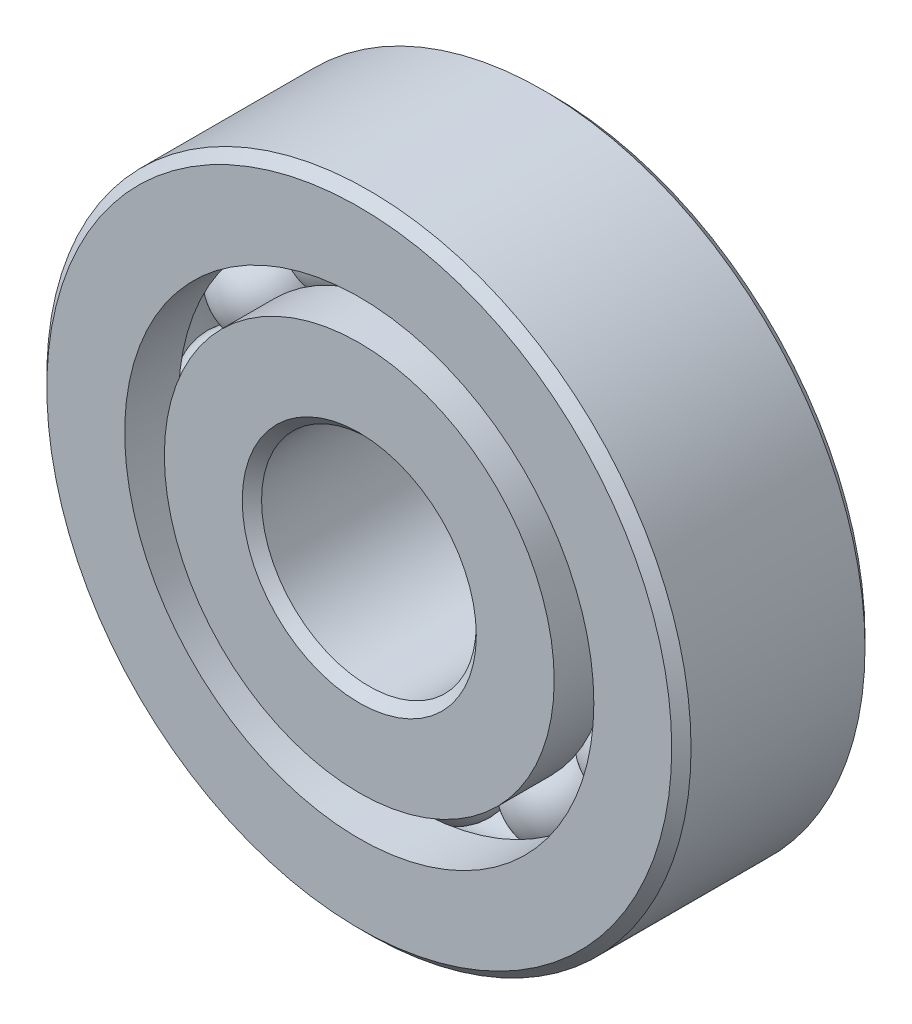
ISO-10303-21;
HEADER;
FILE_DESCRIPTION(('STEP AP214'),'2;1');
FILE_NAME('part.step','',(''),(''),'','','');
FILE_SCHEMA(('AUTOMOTIVE_DESIGN { 1 0 10303 214 1 1 1 1 }'));
ENDSEC;
DATA;
#1=APPLICATION_CONTEXT('core data for automotive mechanical design processes');
#2=APPLICATION_PROTOCOL_DEFINITION('international standard','automotive_design',2000,#1);
#3=PRODUCT_CONTEXT('',#1,'mechanical');
#4=PRODUCT('Part','Part','',(#3));
#5=PRODUCT_RELATED_PRODUCT_CATEGORY('part','',(#4));
#6=PRODUCT_DEFINITION_FORMATION('','',#4);
#7=PRODUCT_DEFINITION_CONTEXT('part definition',#1,'design');
#8=PRODUCT_DEFINITION('design','',#6,#7);
#9=PRODUCT_DEFINITION_SHAPE('','',#8);
#10=(LENGTH_UNIT() NAMED_UNIT(*) SI_UNIT(.MILLI.,.METRE.));
#11=(NAMED_UNIT(*) PLANE_ANGLE_UNIT() SI_UNIT($,.RADIAN.));
#12=(NAMED_UNIT(*) SI_UNIT($,.STERADIAN.) SOLID_ANGLE_UNIT());
#13=UNCERTAINTY_MEASURE_WITH_UNIT(LENGTH_MEASURE(1.E-05),#10,'distance_accuracy_value','');
#14=(GEOMETRIC_REPRESENTATION_CONTEXT(3) GLOBAL_UNCERTAINTY_ASSIGNED_CONTEXT((#13)) GLOBAL_UNIT_ASSIGNED_CONTEXT((#10,
#11,#12)) REPRESENTATION_CONTEXT('',''));
#15=CARTESIAN_POINT('',(0.,0.,0.));
#16=DIRECTION('',(0.,0.,1.));
#17=DIRECTION('',(1.,0.,0.));
#18=AXIS2_PLACEMENT_3D('',#15,#16,#17);
#19=CARTESIAN_POINT('',(-4.99999999999989,8.66025403784445,0.));
#20=DIRECTION('',(0.,0.,1.));
#21=DIRECTION('',(-0.499999999999989,0.866025403784445,0.));
#22=AXIS2_PLACEMENT_3D('',#19,#20,#21);
#23=SPHERICAL_SURFACE('',#22,2.20274170204252);
#24=CARTESIAN_POINT('',(-4.99999999999989,8.66025403784445,2.20274170204251));
#25=VERTEX_POINT('',#24);
#26=VERTEX_LOOP('',#25);
#27=FACE_BOUND('',#26,.T.);
#28=ADVANCED_FACE('F39',(#27),#23,.T.);
#29=CLOSED_SHELL('',(#28));
#30=MANIFOLD_SOLID_BREP('B2',#29);
#31=CARTESIAN_POINT('',(-8.66025403784433,5.0000000000001,0.));
#32=DIRECTION('',(0.,0.,1.));
#33=DIRECTION('',(-0.866025403784433,0.50000000000001,0.));
#34=AXIS2_PLACEMENT_3D('',#31,#32,#33);
#35=SPHERICAL_SURFACE('',#34,2.20274170204252);
#36=CARTESIAN_POINT('',(-8.66025403784433,5.0000000000001,2.20274170204251));
#37=VERTEX_POINT('',#36);
#38=VERTEX_LOOP('',#37);
#39=FACE_BOUND('',#38,.T.);
#40=ADVANCED_FACE('F59',(#39),#35,.T.);
#41=CLOSED_SHELL('',(#40));
#42=MANIFOLD_SOLID_BREP('B6',#41);
#43=CARTESIAN_POINT('',(-10.,1.04744440165294E-13,0.));
#44=DIRECTION('',(0.,0.,1.));
#45=DIRECTION('',(-1.,0.,0.));
#46=AXIS2_PLACEMENT_3D('',#43,#44,#45);
#47=SPHERICAL_SURFACE('',#46,2.20274170204252);
#48=CARTESIAN_POINT('',(-10.,1.04744440165294E-13,2.20274170204251));
#49=VERTEX_POINT('',#48);
#50=VERTEX_LOOP('',#49);
#51=FACE_BOUND('',#50,.T.);
#52=ADVANCED_FACE('F79',(#51),#47,.T.);
#53=CLOSED_SHELL('',(#52));
#54=MANIFOLD_SOLID_BREP('B35',#53);
#55=CARTESIAN_POINT('',(-8.66025403784443,-4.99999999999992,0.));
#56=DIRECTION('',(0.,0.,1.));
#57=DIRECTION('',(-0.866025403784443,-0.499999999999992,0.));
#58=AXIS2_PLACEMENT_3D('',#55,#56,#57);
#59=SPHERICAL_SURFACE('',#58,2.20274170204252);
#60=CARTESIAN_POINT('',(-8.66025403784443,-4.99999999999992,2.20274170204251));
#61=VERTEX_POINT('',#60);
#62=VERTEX_LOOP('',#61);
#63=FACE_BOUND('',#62,.T.);
#64=ADVANCED_FACE('F99',(#63),#59,.T.);
#65=CLOSED_SHELL('',(#64));
#66=MANIFOLD_SOLID_BREP('B55',#65);
#67=CARTESIAN_POINT('',(-5.00000000000007,-8.66025403784434,0.));
#68=DIRECTION('',(0.,0.,1.));
#69=DIRECTION('',(-0.500000000000007,-0.866025403784435,0.));
#70=AXIS2_PLACEMENT_3D('',#67,#68,#69);
#71=SPHERICAL_SURFACE('',#70,2.20274170204252);
#72=CARTESIAN_POINT('',(-5.00000000000007,-8.66025403784434,2.20274170204251));
#73=VERTEX_POINT('',#72);
#74=VERTEX_LOOP('',#73);
#75=FACE_BOUND('',#74,.T.);
#76=ADVANCED_FACE('F119',(#75),#71,.T.);
#77=CLOSED_SHELL('',(#76));
#78=MANIFOLD_SOLID_BREP('B75',#77);
#79=CARTESIAN_POINT('',(0.,-10.,0.));
#80=DIRECTION('',(0.,0.,1.));
#81=DIRECTION('',(0.,-1.,0.));
#82=AXIS2_PLACEMENT_3D('',#79,#80,#81);
#83=SPHERICAL_SURFACE('',#82,2.20274170204252);
#84=CARTESIAN_POINT('',(0.,-10.,2.20274170204251));
#85=VERTEX_POINT('',#84);
#86=VERTEX_LOOP('',#85);
#87=FACE_BOUND('',#86,.T.);
#88=ADVANCED_FACE('F139',(#87),#83,.T.);
#89=CLOSED_SHELL('',(#88));
#90=MANIFOLD_SOLID_BREP('B95',#89);
#91=CARTESIAN_POINT('',(4.99999999999995,-8.66025403784441,0.));
#92=DIRECTION('',(0.,0.,1.));
#93=DIRECTION('',(0.499999999999995,-0.866025403784442,0.));
#94=AXIS2_PLACEMENT_3D('',#91,#92,#93);
#95=SPHERICAL_SURFACE('',#94,2.20274170204252);
#96=CARTESIAN_POINT('',(4.99999999999995,-8.66025403784441,2.20274170204251));
#97=VERTEX_POINT('',#96);
#98=VERTEX_LOOP('',#97);
#99=FACE_BOUND('',#98,.T.);
#100=ADVANCED_FACE('F159',(#99),#95,.T.);
#101=CLOSED_SHELL('',(#100));
#102=MANIFOLD_SOLID_BREP('B115',#101);
#103=CARTESIAN_POINT('',(8.66025403784436,-5.00000000000004,0.));
#104=DIRECTION('',(0.,0.,1.));
#105=DIRECTION('',(0.866025403784436,-0.500000000000004,0.));
#106=AXIS2_PLACEMENT_3D('',#103,#104,#105);
#107=SPHERICAL_SURFACE('',#106,2.20274170204252);
#108=CARTESIAN_POINT('',(8.66025403784436,-5.00000000000004,2.20274170204251));
#109=VERTEX_POINT('',#108);
#110=VERTEX_LOOP('',#109);
#111=FACE_BOUND('',#110,.T.);
#112=ADVANCED_FACE('F179',(#111),#107,.T.);
#113=CLOSED_SHELL('',(#112));
#114=MANIFOLD_SOLID_BREP('B135',#113);
#115=CARTESIAN_POINT('',(10.,0.,0.));
#116=DIRECTION('',(0.,0.,1.));
#117=DIRECTION('',(1.,0.,0.));
#118=AXIS2_PLACEMENT_3D('',#115,#116,#117);
#119=SPHERICAL_SURFACE('',#118,2.20274170204252);
#120=CARTESIAN_POINT('',(10.,0.,2.20274170204251));
#121=VERTEX_POINT('',#120);
#122=VERTEX_LOOP('',#121);
#123=FACE_BOUND('',#122,.T.);
#124=ADVANCED_FACE('F199',(#123),#119,.T.);
#125=CLOSED_SHELL('',(#124));
#126=MANIFOLD_SOLID_BREP('B155',#125);
#127=CARTESIAN_POINT('',(8.6602540378444,4.99999999999998,0.));
#128=DIRECTION('',(0.,0.,1.));
#129=DIRECTION('',(0.86602540378444,0.499999999999998,0.));
#130=AXIS2_PLACEMENT_3D('',#127,#128,#129);
#131=SPHERICAL_SURFACE('',#130,2.20274170204252);
#132=CARTESIAN_POINT('',(8.6602540378444,4.99999999999998,2.20274170204251));
#133=VERTEX_POINT('',#132);
#134=VERTEX_LOOP('',#133);
#135=FACE_BOUND('',#134,.T.);
#136=ADVANCED_FACE('F219',(#135),#131,.T.);
#137=CLOSED_SHELL('',(#136));
#138=MANIFOLD_SOLID_BREP('B175',#137);
#139=CARTESIAN_POINT('',(5.00000000000001,8.66025403784438,0.));
#140=DIRECTION('',(0.,0.,1.));
#141=DIRECTION('',(0.500000000000001,0.866025403784438,0.));
#142=AXIS2_PLACEMENT_3D('',#139,#140,#141);
#143=SPHERICAL_SURFACE('',#142,2.20274170204252);
#144=CARTESIAN_POINT('',(5.00000000000001,8.66025403784438,2.20274170204251));
#145=VERTEX_POINT('',#144);
#146=VERTEX_LOOP('',#145);
#147=FACE_BOUND('',#146,.T.);
#148=ADVANCED_FACE('F239',(#147),#143,.T.);
#149=CLOSED_SHELL('',(#148));
#150=MANIFOLD_SOLID_BREP('B195',#149);
#151=CARTESIAN_POINT('',(0.,10.,0.));
#152=DIRECTION('',(0.,0.,1.));
#153=DIRECTION('',(0.,1.,0.));
#154=AXIS2_PLACEMENT_3D('',#151,#152,#153);
#155=SPHERICAL_SURFACE('',#154,2.20274170204252);
#156=CARTESIAN_POINT('',(0.,10.,2.20274170204251));
#157=VERTEX_POINT('',#156);
#158=VERTEX_LOOP('',#157);
#159=FACE_BOUND('',#158,.T.);
#160=ADVANCED_FACE('F261',(#159),#155,.T.);
#161=CLOSED_SHELL('',(#160));
#162=MANIFOLD_SOLID_BREP('B215',#161);
#163=CARTESIAN_POINT('',(0.,9.07692307692307,4.5));
#164=DIRECTION('',(0.,0.,-1.));
#165=DIRECTION('',(-1.,0.,0.));
#166=AXIS2_PLACEMENT_3D('',#163,#164,#165);
#167=PLANE('',#166);
#168=CARTESIAN_POINT('',(0.,0.,4.5));
#169=DIRECTION('',(0.,0.,1.));
#170=DIRECTION('',(1.,0.,0.));
#171=AXIS2_PLACEMENT_3D('',#168,#169,#170);
#172=CIRCLE('',#171,5.45);
#173=CARTESIAN_POINT('',(5.45,0.,4.5));
#174=VERTEX_POINT('',#173);
#175=EDGE_CURVE('E308',#174,#174,#172,.T.);
#176=ORIENTED_EDGE('',*,*,#175,.F.);
#177=EDGE_LOOP('',(#176));
#178=FACE_BOUND('',#177,.T.);
#179=CARTESIAN_POINT('',(0.,0.,4.5));
#180=DIRECTION('',(0.,0.,1.));
#181=DIRECTION('',(1.,0.,0.));
#182=AXIS2_PLACEMENT_3D('',#179,#180,#181);
#183=CIRCLE('',#182,9.07692307692307);
#184=CARTESIAN_POINT('',(9.07692307692307,0.,4.5));
#185=VERTEX_POINT('',#184);
#186=EDGE_CURVE('E260',#185,#185,#183,.T.);
#187=ORIENTED_EDGE('',*,*,#186,.T.);
#188=EDGE_LOOP('',(#187));
#189=FACE_BOUND('',#188,.T.);
#190=ADVANCED_FACE('F280',(#178,#189),#167,.F.);
#191=CARTESIAN_POINT('',(0.,0.,4.5));
#192=DIRECTION('',(0.,0.,1.));
#193=DIRECTION('',(1.,0.,0.));
#194=AXIS2_PLACEMENT_3D('',#191,#192,#193);
#195=CYLINDRICAL_SURFACE('',#194,9.07692307692307);
#196=ORIENTED_EDGE('',*,*,#186,.F.);
#197=EDGE_LOOP('',(#196));
#198=FACE_BOUND('',#197,.T.);
#199=CARTESIAN_POINT('',(0.,0.,2.));
#200=DIRECTION('',(0.,0.,1.));
#201=DIRECTION('',(1.,0.,0.));
#202=AXIS2_PLACEMENT_3D('',#199,#200,#201);
#203=CIRCLE('',#202,9.07692307692307);
#204=CARTESIAN_POINT('',(9.07692307692307,0.,2.));
#205=VERTEX_POINT('',#204);
#206=EDGE_CURVE('E286',#205,#205,#203,.T.);
#207=ORIENTED_EDGE('',*,*,#206,.T.);
#208=EDGE_LOOP('',(#207));
#209=FACE_BOUND('',#208,.T.);
#210=ADVANCED_FACE('F315',(#198,#209),#195,.T.);
#211=CARTESIAN_POINT('',(0.,0.,0.));
#212=DIRECTION('',(0.,0.,1.));
#213=DIRECTION('',(1.,0.,0.));
#214=AXIS2_PLACEMENT_3D('',#211,#212,#213);
#215=TOROIDAL_SURFACE('',#214,10.,2.20274170204252);
#216=ORIENTED_EDGE('',*,*,#206,.F.);
#217=EDGE_LOOP('',(#216));
#218=FACE_BOUND('',#217,.T.);
#219=CARTESIAN_POINT('',(0.,0.,-2.00000000000001));
#220=DIRECTION('',(0.,0.,1.));
#221=DIRECTION('',(1.,0.,0.));
#222=AXIS2_PLACEMENT_3D('',#219,#220,#221);
#223=CIRCLE('',#222,9.07692307692307);
#224=CARTESIAN_POINT('',(9.07692307692307,0.,-2.00000000000001));
#225=VERTEX_POINT('',#224);
#226=EDGE_CURVE('E290',#225,#225,#223,.T.);
#227=ORIENTED_EDGE('',*,*,#226,.T.);
#228=EDGE_LOOP('',(#227));
#229=FACE_BOUND('',#228,.T.);
#230=ADVANCED_FACE('F319',(#218,#229),#215,.F.);
#231=CARTESIAN_POINT('',(0.,0.,4.5));
#232=DIRECTION('',(0.,0.,1.));
#233=DIRECTION('',(1.,0.,0.));
#234=AXIS2_PLACEMENT_3D('',#231,#232,#233);
#235=CYLINDRICAL_SURFACE('',#234,9.07692307692307);
#236=ORIENTED_EDGE('',*,*,#226,.F.);
#237=EDGE_LOOP('',(#236));
#238=FACE_BOUND('',#237,.T.);
#239=CARTESIAN_POINT('',(0.,0.,-4.5));
#240=DIRECTION('',(0.,0.,1.));
#241=DIRECTION('',(1.,0.,0.));
#242=AXIS2_PLACEMENT_3D('',#239,#240,#241);
#243=CIRCLE('',#242,9.07692307692307);
#244=CARTESIAN_POINT('',(9.07692307692307,0.,-4.5));
#245=VERTEX_POINT('',#244);
#246=EDGE_CURVE('E294',#245,#245,#243,.T.);
#247=ORIENTED_EDGE('',*,*,#246,.T.);
#248=EDGE_LOOP('',(#247));
#249=FACE_BOUND('',#248,.T.);
#250=ADVANCED_FACE('F324',(#238,#249),#235,.T.);
#251=CARTESIAN_POINT('',(0.,5.45,-4.5));
#252=DIRECTION('',(0.,0.,1.));
#253=DIRECTION('',(1.,0.,0.));
#254=AXIS2_PLACEMENT_3D('',#251,#252,#253);
#255=PLANE('',#254);
#256=ORIENTED_EDGE('',*,*,#246,.F.);
#257=EDGE_LOOP('',(#256));
#258=FACE_BOUND('',#257,.T.);
#259=CARTESIAN_POINT('',(0.,0.,-4.5));
#260=DIRECTION('',(0.,0.,1.));
#261=DIRECTION('',(1.,0.,0.));
#262=AXIS2_PLACEMENT_3D('',#259,#260,#261);
#263=CIRCLE('',#262,5.45);
#264=CARTESIAN_POINT('',(5.45,0.,-4.5));
#265=VERTEX_POINT('',#264);
#266=EDGE_CURVE('E299',#265,#265,#263,.T.);
#267=ORIENTED_EDGE('',*,*,#266,.T.);
#268=EDGE_LOOP('',(#267));
#269=FACE_BOUND('',#268,.T.);
#270=ADVANCED_FACE('F330',(#258,#269),#255,.F.);
#271=CARTESIAN_POINT('',(0.,0.,-4.05));
#272=DIRECTION('',(0.,0.,-1.));
#273=DIRECTION('',(-1.,0.,0.));
#274=AXIS2_PLACEMENT_3D('',#271,#272,#273);
#275=CONICAL_SURFACE('',#274,5.,0.785398163397449);
#276=ORIENTED_EDGE('',*,*,#266,.F.);
#277=EDGE_LOOP('',(#276));
#278=FACE_BOUND('',#277,.T.);
#279=CARTESIAN_POINT('',(0.,0.,-4.05));
#280=DIRECTION('',(0.,0.,1.));
#281=DIRECTION('',(1.,0.,0.));
#282=AXIS2_PLACEMENT_3D('',#279,#280,#281);
#283=CIRCLE('',#282,5.);
#284=CARTESIAN_POINT('',(5.,0.,-4.05));
#285=VERTEX_POINT('',#284);
#286=EDGE_CURVE('E302',#285,#285,#283,.T.);
#287=ORIENTED_EDGE('',*,*,#286,.T.);
#288=EDGE_LOOP('',(#287));
#289=FACE_BOUND('',#288,.T.);
#290=ADVANCED_FACE('F334',(#278,#289),#275,.F.);
#291=CARTESIAN_POINT('',(0.,0.,4.5));
#292=DIRECTION('',(0.,0.,1.));
#293=DIRECTION('',(1.,0.,0.));
#294=AXIS2_PLACEMENT_3D('',#291,#292,#293);
#295=CYLINDRICAL_SURFACE('',#294,5.);
#296=ORIENTED_EDGE('',*,*,#286,.F.);
#297=EDGE_LOOP('',(#296));
#298=FACE_BOUND('',#297,.T.);
#299=CARTESIAN_POINT('',(0.,0.,4.05));
#300=DIRECTION('',(0.,0.,1.));
#301=DIRECTION('',(1.,0.,0.));
#302=AXIS2_PLACEMENT_3D('',#299,#300,#301);
#303=CIRCLE('',#302,5.);
#304=CARTESIAN_POINT('',(5.,0.,4.05));
#305=VERTEX_POINT('',#304);
#306=EDGE_CURVE('E305',#305,#305,#303,.T.);
#307=ORIENTED_EDGE('',*,*,#306,.T.);
#308=EDGE_LOOP('',(#307));
#309=FACE_BOUND('',#308,.T.);
#310=ADVANCED_FACE('F338',(#298,#309),#295,.F.);
#311=CARTESIAN_POINT('',(0.,0.,4.5));
#312=DIRECTION('',(0.,0.,1.));
#313=DIRECTION('',(1.,0.,0.));
#314=AXIS2_PLACEMENT_3D('',#311,#312,#313);
#315=CONICAL_SURFACE('',#314,5.45,0.785398163397445);
#316=ORIENTED_EDGE('',*,*,#306,.F.);
#317=EDGE_LOOP('',(#316));
#318=FACE_BOUND('',#317,.T.);
#319=ORIENTED_EDGE('',*,*,#175,.T.);
#320=EDGE_LOOP('',(#319));
#321=FACE_BOUND('',#320,.T.);
#322=ADVANCED_FACE('F312',(#318,#321),#315,.F.);
#323=CLOSED_SHELL('',(#190,#210,#230,#250,#270,#290,#310,#322));
#324=MANIFOLD_SOLID_BREP('B235',#323);
#325=CARTESIAN_POINT('',(0.,0.,4.05));
#326=DIRECTION('',(0.,0.,-1.));
#327=DIRECTION('',(-1.,0.,0.));
#328=AXIS2_PLACEMENT_3D('',#325,#326,#327);
#329=CONICAL_SURFACE('',#328,15.,0.785398163397447);
#330=CARTESIAN_POINT('',(0.,0.,4.5));
#331=DIRECTION('',(0.,0.,1.));
#332=DIRECTION('',(1.,0.,0.));
#333=AXIS2_PLACEMENT_3D('',#330,#331,#332);
#334=CIRCLE('',#333,14.55);
#335=CARTESIAN_POINT('',(14.55,0.,4.5));
#336=VERTEX_POINT('',#335);
#337=EDGE_CURVE('E429',#336,#336,#334,.T.);
#338=ORIENTED_EDGE('',*,*,#337,.F.);
#339=EDGE_LOOP('',(#338));
#340=FACE_BOUND('',#339,.T.);
#341=CARTESIAN_POINT('',(0.,0.,4.05));
#342=DIRECTION('',(0.,0.,1.));
#343=DIRECTION('',(1.,0.,0.));
#344=AXIS2_PLACEMENT_3D('',#341,#342,#343);
#345=CIRCLE('',#344,15.);
#346=CARTESIAN_POINT('',(15.,0.,4.05));
#347=VERTEX_POINT('',#346);
#348=EDGE_CURVE('E279',#347,#347,#345,.T.);
#349=ORIENTED_EDGE('',*,*,#348,.T.);
#350=EDGE_LOOP('',(#349));
#351=FACE_BOUND('',#350,.T.);
#352=ADVANCED_FACE('F401',(#340,#351),#329,.T.);
#353=CARTESIAN_POINT('',(0.,0.,4.5));
#354=DIRECTION('',(0.,0.,1.));
#355=DIRECTION('',(1.,0.,0.));
#356=AXIS2_PLACEMENT_3D('',#353,#354,#355);
#357=CYLINDRICAL_SURFACE('',#356,15.);
#358=ORIENTED_EDGE('',*,*,#348,.F.);
#359=EDGE_LOOP('',(#358));
#360=FACE_BOUND('',#359,.T.);
#361=CARTESIAN_POINT('',(0.,0.,-4.05));
#362=DIRECTION('',(0.,0.,1.));
#363=DIRECTION('',(1.,0.,0.));
#364=AXIS2_PLACEMENT_3D('',#361,#362,#363);
#365=CIRCLE('',#364,15.);
#366=CARTESIAN_POINT('',(15.,0.,-4.05));
#367=VERTEX_POINT('',#366);
#368=EDGE_CURVE('E407',#367,#367,#365,.T.);
#369=ORIENTED_EDGE('',*,*,#368,.T.);
#370=EDGE_LOOP('',(#369));
#371=FACE_BOUND('',#370,.T.);
#372=ADVANCED_FACE('F436',(#360,#371),#357,.T.);
#373=CARTESIAN_POINT('',(0.,0.,-4.5));
#374=DIRECTION('',(0.,0.,1.));
#375=DIRECTION('',(1.,0.,0.));
#376=AXIS2_PLACEMENT_3D('',#373,#374,#375);
#377=CONICAL_SURFACE('',#376,14.55,0.785398163397448);
#378=ORIENTED_EDGE('',*,*,#368,.F.);
#379=EDGE_LOOP('',(#378));
#380=FACE_BOUND('',#379,.T.);
#381=CARTESIAN_POINT('',(0.,0.,-4.5));
#382=DIRECTION('',(0.,0.,1.));
#383=DIRECTION('',(1.,0.,0.));
#384=AXIS2_PLACEMENT_3D('',#381,#382,#383);
#385=CIRCLE('',#384,14.55);
#386=CARTESIAN_POINT('',(14.55,0.,-4.5));
#387=VERTEX_POINT('',#386);
#388=EDGE_CURVE('E411',#387,#387,#385,.T.);
#389=ORIENTED_EDGE('',*,*,#388,.T.);
#390=EDGE_LOOP('',(#389));
#391=FACE_BOUND('',#390,.T.);
#392=ADVANCED_FACE('F440',(#380,#391),#377,.T.);
#393=CARTESIAN_POINT('',(0.,14.55,-4.5));
#394=DIRECTION('',(0.,0.,1.));
#395=DIRECTION('',(1.,0.,0.));
#396=AXIS2_PLACEMENT_3D('',#393,#394,#395);
#397=PLANE('',#396);
#398=ORIENTED_EDGE('',*,*,#388,.F.);
#399=EDGE_LOOP('',(#398));
#400=FACE_BOUND('',#399,.T.);
#401=CARTESIAN_POINT('',(0.,0.,-4.5));
#402=DIRECTION('',(0.,0.,1.));
#403=DIRECTION('',(1.,0.,0.));
#404=AXIS2_PLACEMENT_3D('',#401,#402,#403);
#405=CIRCLE('',#404,10.9230769230769);
#406=CARTESIAN_POINT('',(10.9230769230769,0.,-4.5));
#407=VERTEX_POINT('',#406);
#408=EDGE_CURVE('E415',#407,#407,#405,.T.);
#409=ORIENTED_EDGE('',*,*,#408,.T.);
#410=EDGE_LOOP('',(#409));
#411=FACE_BOUND('',#410,.T.);
#412=ADVANCED_FACE('F445',(#400,#411),#397,.F.);
#413=CARTESIAN_POINT('',(0.,0.,4.5));
#414=DIRECTION('',(0.,0.,1.));
#415=DIRECTION('',(1.,0.,0.));
#416=AXIS2_PLACEMENT_3D('',#413,#414,#415);
#417=CYLINDRICAL_SURFACE('',#416,10.9230769230769);
#418=ORIENTED_EDGE('',*,*,#408,.F.);
#419=EDGE_LOOP('',(#418));
#420=FACE_BOUND('',#419,.T.);
#421=CARTESIAN_POINT('',(0.,0.,-2.));
#422=DIRECTION('',(0.,0.,1.));
#423=DIRECTION('',(1.,0.,0.));
#424=AXIS2_PLACEMENT_3D('',#421,#422,#423);
#425=CIRCLE('',#424,10.9230769230769);
#426=CARTESIAN_POINT('',(10.9230769230769,0.,-2.));
#427=VERTEX_POINT('',#426);
#428=EDGE_CURVE('E420',#427,#427,#425,.T.);
#429=ORIENTED_EDGE('',*,*,#428,.T.);
#430=EDGE_LOOP('',(#429));
#431=FACE_BOUND('',#430,.T.);
#432=ADVANCED_FACE('F451',(#420,#431),#417,.F.);
#433=CARTESIAN_POINT('',(0.,0.,0.));
#434=DIRECTION('',(0.,0.,1.));
#435=DIRECTION('',(1.,0.,0.));
#436=AXIS2_PLACEMENT_3D('',#433,#434,#435);
#437=TOROIDAL_SURFACE('',#436,10.,2.20274170204252);
#438=ORIENTED_EDGE('',*,*,#428,.F.);
#439=EDGE_LOOP('',(#438));
#440=FACE_BOUND('',#439,.T.);
#441=CARTESIAN_POINT('',(0.,0.,2.));
#442=DIRECTION('',(0.,0.,1.));
#443=DIRECTION('',(1.,0.,0.));
#444=AXIS2_PLACEMENT_3D('',#441,#442,#443);
#445=CIRCLE('',#444,10.9230769230769);
#446=CARTESIAN_POINT('',(10.9230769230769,0.,2.));
#447=VERTEX_POINT('',#446);
#448=EDGE_CURVE('E423',#447,#447,#445,.T.);
#449=ORIENTED_EDGE('',*,*,#448,.T.);
#450=EDGE_LOOP('',(#449));
#451=FACE_BOUND('',#450,.T.);
#452=ADVANCED_FACE('F455',(#440,#451),#437,.F.);
#453=CARTESIAN_POINT('',(0.,0.,4.5));
#454=DIRECTION('',(0.,0.,1.));
#455=DIRECTION('',(1.,0.,0.));
#456=AXIS2_PLACEMENT_3D('',#453,#454,#455);
#457=CYLINDRICAL_SURFACE('',#456,10.9230769230769);
#458=ORIENTED_EDGE('',*,*,#448,.F.);
#459=EDGE_LOOP('',(#458));
#460=FACE_BOUND('',#459,.T.);
#461=CARTESIAN_POINT('',(0.,0.,4.5));
#462=DIRECTION('',(0.,0.,1.));
#463=DIRECTION('',(1.,0.,0.));
#464=AXIS2_PLACEMENT_3D('',#461,#462,#463);
#465=CIRCLE('',#464,10.9230769230769);
#466=CARTESIAN_POINT('',(10.9230769230769,0.,4.5));
#467=VERTEX_POINT('',#466);
#468=EDGE_CURVE('E426',#467,#467,#465,.T.);
#469=ORIENTED_EDGE('',*,*,#468,.T.);
#470=EDGE_LOOP('',(#469));
#471=FACE_BOUND('',#470,.T.);
#472=ADVANCED_FACE('F459',(#460,#471),#457,.F.);
#473=CARTESIAN_POINT('',(0.,14.55,4.5));
#474=DIRECTION('',(0.,0.,-1.));
#475=DIRECTION('',(-1.,0.,0.));
#476=AXIS2_PLACEMENT_3D('',#473,#474,#475);
#477=PLANE('',#476);
#478=ORIENTED_EDGE('',*,*,#468,.F.);
#479=EDGE_LOOP('',(#478));
#480=FACE_BOUND('',#479,.T.);
#481=ORIENTED_EDGE('',*,*,#337,.T.);
#482=EDGE_LOOP('',(#481));
#483=FACE_BOUND('',#482,.T.);
#484=ADVANCED_FACE('F433',(#480,#483),#477,.F.);
#485=CLOSED_SHELL('',(#352,#372,#392,#412,#432,#452,#472,#484));
#486=MANIFOLD_SOLID_BREP('B255',#485);
#487=ADVANCED_BREP_SHAPE_REPRESENTATION('',(#18,#30,#42,#54,#66,#78,#90,#102,#114,#126,#138,
#150,#162,#324,#486),#14);
#488=SHAPE_DEFINITION_REPRESENTATION(#9,#487);
ENDSEC;
END-ISO-10303-21;
